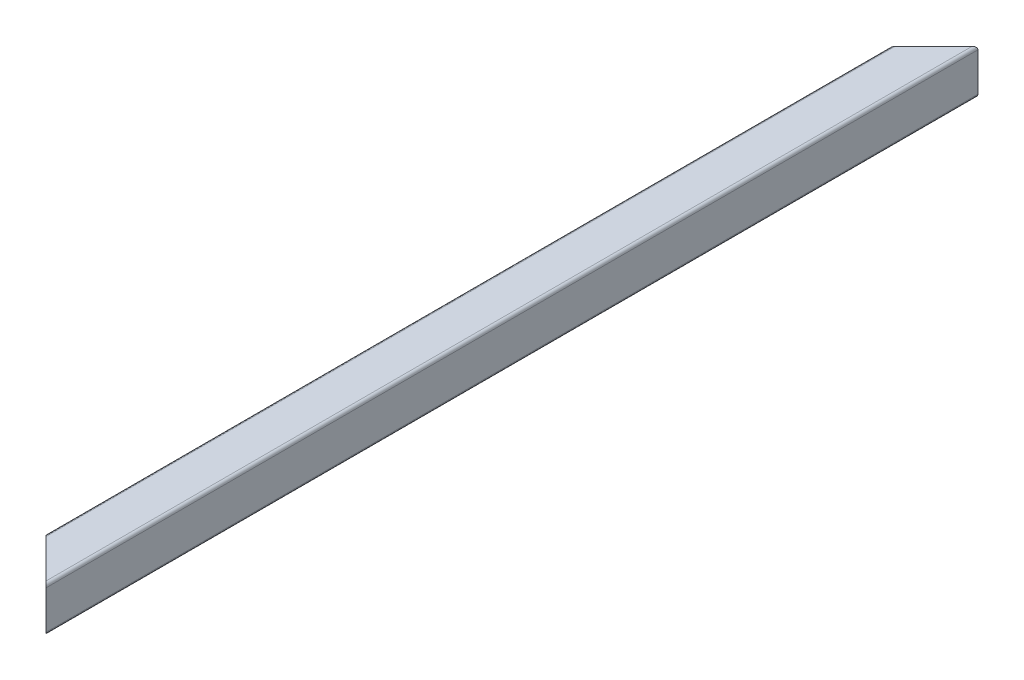
ISO-10303-21;
HEADER;
FILE_DESCRIPTION(('STEP AP214'),'2;1');
FILE_NAME('part.step','',(''),(''),'','','');
FILE_SCHEMA(('AUTOMOTIVE_DESIGN { 1 0 10303 214 1 1 1 1 }'));
ENDSEC;
DATA;
#1=APPLICATION_CONTEXT('core data for automotive mechanical design processes');
#2=APPLICATION_PROTOCOL_DEFINITION('international standard','automotive_design',2000,#1);
#3=PRODUCT_CONTEXT('',#1,'mechanical');
#4=PRODUCT('Part','Part','',(#3));
#5=PRODUCT_RELATED_PRODUCT_CATEGORY('part','',(#4));
#6=PRODUCT_DEFINITION_FORMATION('','',#4);
#7=PRODUCT_DEFINITION_CONTEXT('part definition',#1,'design');
#8=PRODUCT_DEFINITION('design','',#6,#7);
#9=PRODUCT_DEFINITION_SHAPE('','',#8);
#10=(LENGTH_UNIT() NAMED_UNIT(*) SI_UNIT(.MILLI.,.METRE.));
#11=(NAMED_UNIT(*) PLANE_ANGLE_UNIT() SI_UNIT($,.RADIAN.));
#12=(NAMED_UNIT(*) SI_UNIT($,.STERADIAN.) SOLID_ANGLE_UNIT());
#13=UNCERTAINTY_MEASURE_WITH_UNIT(LENGTH_MEASURE(1.E-05),#10,'distance_accuracy_value','');
#14=(GEOMETRIC_REPRESENTATION_CONTEXT(3) GLOBAL_UNCERTAINTY_ASSIGNED_CONTEXT((#13)) GLOBAL_UNIT_ASSIGNED_CONTEXT((#10,
#11,#12)) REPRESENTATION_CONTEXT('',''));
#15=CARTESIAN_POINT('',(0.,0.,0.));
#16=DIRECTION('',(0.,0.,1.));
#17=DIRECTION('',(1.,0.,0.));
#18=AXIS2_PLACEMENT_3D('',#15,#16,#17);
#19=CARTESIAN_POINT('',(15.,13.,-315.));
#20=DIRECTION('',(1.,0.,0.));
#21=DIRECTION('',(0.,1.,0.));
#22=AXIS2_PLACEMENT_3D('',#19,#20,#21);
#23=PLANE('',#22);
#24=DIRECTION('',(0.,0.,1.));
#25=VECTOR('',#24,1.);
#26=CARTESIAN_POINT('',(15.,13.,-315.));
#27=LINE('',#26,#25);
#28=CARTESIAN_POINT('',(15.,13.,-315.));
#29=VERTEX_POINT('',#28);
#30=CARTESIAN_POINT('',(15.,13.,315.));
#31=VERTEX_POINT('',#30);
#32=EDGE_CURVE('E157',#29,#31,#27,.T.);
#33=ORIENTED_EDGE('',*,*,#32,.T.);
#34=DIRECTION('',(0.,1.,0.));
#35=VECTOR('',#34,1.);
#36=CARTESIAN_POINT('',(15.,13.,315.));
#37=LINE('',#36,#35);
#38=CARTESIAN_POINT('',(15.,-13.,315.));
#39=VERTEX_POINT('',#38);
#40=EDGE_CURVE('E213',#39,#31,#37,.T.);
#41=ORIENTED_EDGE('',*,*,#40,.F.);
#42=DIRECTION('',(0.,0.,1.));
#43=VECTOR('',#42,1.);
#44=CARTESIAN_POINT('',(15.,-13.,-315.));
#45=LINE('',#44,#43);
#46=CARTESIAN_POINT('',(15.,-13.,-315.));
#47=VERTEX_POINT('',#46);
#48=EDGE_CURVE('E159',#47,#39,#45,.T.);
#49=ORIENTED_EDGE('',*,*,#48,.F.);
#50=DIRECTION('',(0.,1.,0.));
#51=VECTOR('',#50,1.);
#52=CARTESIAN_POINT('',(15.,13.,-315.));
#53=LINE('',#52,#51);
#54=EDGE_CURVE('E161',#47,#29,#53,.T.);
#55=ORIENTED_EDGE('',*,*,#54,.T.);
#56=EDGE_LOOP('',(#33,#41,#49,#55));
#57=FACE_BOUND('',#56,.T.);
#58=ADVANCED_FACE('F34',(#57),#23,.T.);
#59=CARTESIAN_POINT('',(13.,13.,-315.));
#60=DIRECTION('',(0.,0.,1.));
#61=DIRECTION('',(1.,0.,0.));
#62=AXIS2_PLACEMENT_3D('',#59,#60,#61);
#63=CYLINDRICAL_SURFACE('',#62,2.);
#64=ORIENTED_EDGE('',*,*,#32,.F.);
#65=CARTESIAN_POINT('',(13.,13.,-313.));
#66=DIRECTION('',(-0.707106781186544,0.,-0.707106781186551));
#67=DIRECTION('',(-0.707106781186551,0.,0.707106781186544));
#68=AXIS2_PLACEMENT_3D('',#65,#66,#67);
#69=ELLIPSE('',#68,2.82842712474618,2.);
#70=CARTESIAN_POINT('',(13.,15.,-313.));
#71=VERTEX_POINT('',#70);
#72=EDGE_CURVE('E202',#29,#71,#69,.F.);
#73=ORIENTED_EDGE('',*,*,#72,.T.);
#74=DIRECTION('',(0.,0.,1.));
#75=VECTOR('',#74,1.);
#76=CARTESIAN_POINT('',(13.,15.,-315.));
#77=LINE('',#76,#75);
#78=CARTESIAN_POINT('',(13.,15.,313.));
#79=VERTEX_POINT('',#78);
#80=EDGE_CURVE('E151',#71,#79,#77,.T.);
#81=ORIENTED_EDGE('',*,*,#80,.T.);
#82=CARTESIAN_POINT('',(13.,13.,313.));
#83=DIRECTION('',(-0.707106781186544,0.,0.707106781186551));
#84=DIRECTION('',(0.707106781186551,0.,0.707106781186544));
#85=AXIS2_PLACEMENT_3D('',#82,#83,#84);
#86=ELLIPSE('',#85,2.82842712474618,2.);
#87=EDGE_CURVE('E232',#79,#31,#86,.F.);
#88=ORIENTED_EDGE('',*,*,#87,.T.);
#89=EDGE_LOOP('',(#64,#73,#81,#88));
#90=FACE_BOUND('',#89,.T.);
#91=ADVANCED_FACE('F245',(#90),#63,.T.);
#92=CARTESIAN_POINT('',(-13.,15.,-315.));
#93=DIRECTION('',(0.,1.,0.));
#94=DIRECTION('',(0.,0.,1.));
#95=AXIS2_PLACEMENT_3D('',#92,#93,#94);
#96=PLANE('',#95);
#97=ORIENTED_EDGE('',*,*,#80,.F.);
#98=DIRECTION('',(-0.707106781186551,0.,0.707106781186544));
#99=VECTOR('',#98,1.);
#100=CARTESIAN_POINT('',(0.999999999999864,15.,-301.));
#101=LINE('',#100,#99);
#102=CARTESIAN_POINT('',(-13.,15.,-287.));
#103=VERTEX_POINT('',#102);
#104=EDGE_CURVE('E205',#71,#103,#101,.T.);
#105=ORIENTED_EDGE('',*,*,#104,.T.);
#106=DIRECTION('',(0.,0.,1.));
#107=VECTOR('',#106,1.);
#108=CARTESIAN_POINT('',(-13.,15.,-315.));
#109=LINE('',#108,#107);
#110=CARTESIAN_POINT('',(-13.,15.,287.));
#111=VERTEX_POINT('',#110);
#112=EDGE_CURVE('E147',#103,#111,#109,.T.);
#113=ORIENTED_EDGE('',*,*,#112,.T.);
#114=DIRECTION('',(0.707106781186551,0.,0.707106781186544));
#115=VECTOR('',#114,1.);
#116=CARTESIAN_POINT('',(-314.,15.,-13.9999999999967));
#117=LINE('',#116,#115);
#118=EDGE_CURVE('E127',#111,#79,#117,.T.);
#119=ORIENTED_EDGE('',*,*,#118,.T.);
#120=EDGE_LOOP('',(#97,#105,#113,#119));
#121=FACE_BOUND('',#120,.T.);
#122=ADVANCED_FACE('F242',(#121),#96,.T.);
#123=CARTESIAN_POINT('',(-13.,13.,-315.));
#124=DIRECTION('',(0.,0.,1.));
#125=DIRECTION('',(1.,0.,0.));
#126=AXIS2_PLACEMENT_3D('',#123,#124,#125);
#127=CYLINDRICAL_SURFACE('',#126,2.);
#128=ORIENTED_EDGE('',*,*,#112,.F.);
#129=CARTESIAN_POINT('',(-13.,13.,-287.));
#130=DIRECTION('',(-0.707106781186544,0.,-0.707106781186551));
#131=DIRECTION('',(-0.707106781186551,0.,0.707106781186544));
#132=AXIS2_PLACEMENT_3D('',#129,#130,#131);
#133=ELLIPSE('',#132,2.82842712474618,2.);
#134=CARTESIAN_POINT('',(-15.,13.,-285.));
#135=VERTEX_POINT('',#134);
#136=EDGE_CURVE('E146',#103,#135,#133,.F.);
#137=ORIENTED_EDGE('',*,*,#136,.T.);
#138=DIRECTION('',(0.,0.,1.));
#139=VECTOR('',#138,1.);
#140=CARTESIAN_POINT('',(-15.,13.,-315.));
#141=LINE('',#140,#139);
#142=CARTESIAN_POINT('',(-15.,13.,285.));
#143=VERTEX_POINT('',#142);
#144=EDGE_CURVE('E139',#135,#143,#141,.T.);
#145=ORIENTED_EDGE('',*,*,#144,.T.);
#146=CARTESIAN_POINT('',(-13.,13.,287.));
#147=DIRECTION('',(-0.707106781186544,0.,0.707106781186551));
#148=DIRECTION('',(0.707106781186551,0.,0.707106781186544));
#149=AXIS2_PLACEMENT_3D('',#146,#147,#148);
#150=ELLIPSE('',#149,2.82842712474618,2.);
#151=EDGE_CURVE('E121',#143,#111,#150,.F.);
#152=ORIENTED_EDGE('',*,*,#151,.T.);
#153=EDGE_LOOP('',(#128,#137,#145,#152));
#154=FACE_BOUND('',#153,.T.);
#155=ADVANCED_FACE('F145',(#154),#127,.T.);
#156=CARTESIAN_POINT('',(-15.,13.,-315.));
#157=DIRECTION('',(-1.,0.,0.));
#158=DIRECTION('',(0.,-1.,0.));
#159=AXIS2_PLACEMENT_3D('',#156,#157,#158);
#160=PLANE('',#159);
#161=ORIENTED_EDGE('',*,*,#144,.F.);
#162=DIRECTION('',(0.,-1.,0.));
#163=VECTOR('',#162,1.);
#164=CARTESIAN_POINT('',(-15.,250.,-285.));
#165=LINE('',#164,#163);
#166=CARTESIAN_POINT('',(-15.,-13.,-285.));
#167=VERTEX_POINT('',#166);
#168=EDGE_CURVE('E142',#135,#167,#165,.T.);
#169=ORIENTED_EDGE('',*,*,#168,.T.);
#170=DIRECTION('',(0.,0.,1.));
#171=VECTOR('',#170,1.);
#172=CARTESIAN_POINT('',(-15.,-13.,-315.));
#173=LINE('',#172,#171);
#174=CARTESIAN_POINT('',(-15.,-13.,285.));
#175=VERTEX_POINT('',#174);
#176=EDGE_CURVE('E141',#167,#175,#173,.T.);
#177=ORIENTED_EDGE('',*,*,#176,.T.);
#178=DIRECTION('',(0.,-1.,0.));
#179=VECTOR('',#178,1.);
#180=CARTESIAN_POINT('',(-15.,250.,285.));
#181=LINE('',#180,#179);
#182=EDGE_CURVE('E124',#143,#175,#181,.T.);
#183=ORIENTED_EDGE('',*,*,#182,.F.);
#184=EDGE_LOOP('',(#161,#169,#177,#183));
#185=FACE_BOUND('',#184,.T.);
#186=ADVANCED_FACE('F137',(#185),#160,.T.);
#187=CARTESIAN_POINT('',(-13.,-13.,-315.));
#188=DIRECTION('',(0.,0.,1.));
#189=DIRECTION('',(1.,0.,0.));
#190=AXIS2_PLACEMENT_3D('',#187,#188,#189);
#191=CYLINDRICAL_SURFACE('',#190,2.);
#192=ORIENTED_EDGE('',*,*,#176,.F.);
#193=CARTESIAN_POINT('',(-13.,-13.,-287.));
#194=DIRECTION('',(-0.707106781186544,0.,-0.707106781186551));
#195=DIRECTION('',(-0.707106781186551,0.,0.707106781186544));
#196=AXIS2_PLACEMENT_3D('',#193,#194,#195);
#197=ELLIPSE('',#196,2.82842712474618,2.);
#198=CARTESIAN_POINT('',(-13.,-15.,-287.));
#199=VERTEX_POINT('',#198);
#200=EDGE_CURVE('E184',#167,#199,#197,.F.);
#201=ORIENTED_EDGE('',*,*,#200,.T.);
#202=DIRECTION('',(0.,0.,1.));
#203=VECTOR('',#202,1.);
#204=CARTESIAN_POINT('',(-13.,-15.,-315.));
#205=LINE('',#204,#203);
#206=CARTESIAN_POINT('',(-13.,-15.,287.));
#207=VERTEX_POINT('',#206);
#208=EDGE_CURVE('E149',#199,#207,#205,.T.);
#209=ORIENTED_EDGE('',*,*,#208,.T.);
#210=CARTESIAN_POINT('',(-13.,-13.,287.));
#211=DIRECTION('',(-0.707106781186544,0.,0.707106781186551));
#212=DIRECTION('',(0.707106781186551,0.,0.707106781186544));
#213=AXIS2_PLACEMENT_3D('',#210,#211,#212);
#214=ELLIPSE('',#213,2.82842712474618,2.);
#215=EDGE_CURVE('E132',#207,#175,#214,.F.);
#216=ORIENTED_EDGE('',*,*,#215,.T.);
#217=EDGE_LOOP('',(#192,#201,#209,#216));
#218=FACE_BOUND('',#217,.T.);
#219=ADVANCED_FACE('F183',(#218),#191,.T.);
#220=CARTESIAN_POINT('',(-13.,-15.,-315.));
#221=DIRECTION('',(0.,-1.,0.));
#222=DIRECTION('',(0.,0.,-1.));
#223=AXIS2_PLACEMENT_3D('',#220,#221,#222);
#224=PLANE('',#223);
#225=ORIENTED_EDGE('',*,*,#208,.F.);
#226=DIRECTION('',(0.707106781186551,0.,-0.707106781186544));
#227=VECTOR('',#226,1.);
#228=CARTESIAN_POINT('',(0.999999999999866,-15.,-301.));
#229=LINE('',#228,#227);
#230=CARTESIAN_POINT('',(13.,-15.,-313.));
#231=VERTEX_POINT('',#230);
#232=EDGE_CURVE('E189',#199,#231,#229,.T.);
#233=ORIENTED_EDGE('',*,*,#232,.T.);
#234=DIRECTION('',(0.,0.,1.));
#235=VECTOR('',#234,1.);
#236=CARTESIAN_POINT('',(13.,-15.,-315.));
#237=LINE('',#236,#235);
#238=CARTESIAN_POINT('',(13.,-15.,313.));
#239=VERTEX_POINT('',#238);
#240=EDGE_CURVE('E42',#231,#239,#237,.T.);
#241=ORIENTED_EDGE('',*,*,#240,.T.);
#242=DIRECTION('',(-0.707106781186551,0.,-0.707106781186544));
#243=VECTOR('',#242,1.);
#244=CARTESIAN_POINT('',(-314.,-15.,-13.9999999999967));
#245=LINE('',#244,#243);
#246=EDGE_CURVE('E191',#239,#207,#245,.T.);
#247=ORIENTED_EDGE('',*,*,#246,.T.);
#248=EDGE_LOOP('',(#225,#233,#241,#247));
#249=FACE_BOUND('',#248,.T.);
#250=ADVANCED_FACE('F188',(#249),#224,.T.);
#251=CARTESIAN_POINT('',(13.,-13.,-315.));
#252=DIRECTION('',(0.,0.,1.));
#253=DIRECTION('',(1.,0.,0.));
#254=AXIS2_PLACEMENT_3D('',#251,#252,#253);
#255=CYLINDRICAL_SURFACE('',#254,2.);
#256=ORIENTED_EDGE('',*,*,#240,.F.);
#257=CARTESIAN_POINT('',(13.,-13.,-313.));
#258=DIRECTION('',(-0.707106781186544,0.,-0.707106781186551));
#259=DIRECTION('',(-0.707106781186551,0.,0.707106781186544));
#260=AXIS2_PLACEMENT_3D('',#257,#258,#259);
#261=ELLIPSE('',#260,2.82842712474618,2.);
#262=EDGE_CURVE('E211',#231,#47,#261,.F.);
#263=ORIENTED_EDGE('',*,*,#262,.T.);
#264=ORIENTED_EDGE('',*,*,#48,.T.);
#265=CARTESIAN_POINT('',(13.,-13.,313.));
#266=DIRECTION('',(-0.707106781186544,0.,0.707106781186551));
#267=DIRECTION('',(0.707106781186551,0.,0.707106781186544));
#268=AXIS2_PLACEMENT_3D('',#265,#266,#267);
#269=ELLIPSE('',#268,2.82842712474618,2.);
#270=EDGE_CURVE('E192',#39,#239,#269,.F.);
#271=ORIENTED_EDGE('',*,*,#270,.T.);
#272=EDGE_LOOP('',(#256,#263,#264,#271));
#273=FACE_BOUND('',#272,.T.);
#274=ADVANCED_FACE('F36',(#273),#255,.T.);
#275=CARTESIAN_POINT('',(15.,250.,315.));
#276=DIRECTION('',(-0.707106781186544,0.,0.707106781186551));
#277=DIRECTION('',(0.707106781186551,0.,0.707106781186544));
#278=AXIS2_PLACEMENT_3D('',#275,#276,#277);
#279=PLANE('',#278);
#280=ORIENTED_EDGE('',*,*,#40,.T.);
#281=ORIENTED_EDGE('',*,*,#87,.F.);
#282=ORIENTED_EDGE('',*,*,#118,.F.);
#283=ORIENTED_EDGE('',*,*,#151,.F.);
#284=ORIENTED_EDGE('',*,*,#182,.T.);
#285=ORIENTED_EDGE('',*,*,#215,.F.);
#286=ORIENTED_EDGE('',*,*,#246,.F.);
#287=ORIENTED_EDGE('',*,*,#270,.F.);
#288=EDGE_LOOP('',(#280,#281,#282,#283,#284,#285,#286,#287));
#289=FACE_BOUND('',#288,.T.);
#290=DIRECTION('',(0.,1.,0.));
#291=VECTOR('',#290,1.);
#292=CARTESIAN_POINT('',(-13.,13.0000000000001,287.));
#293=LINE('',#292,#291);
#294=CARTESIAN_POINT('',(-13.,-13.,287.));
#295=VERTEX_POINT('',#294);
#296=CARTESIAN_POINT('',(-13.,13.,287.));
#297=VERTEX_POINT('',#296);
#298=EDGE_CURVE('E230',#295,#297,#293,.T.);
#299=ORIENTED_EDGE('',*,*,#298,.T.);
#300=DIRECTION('',(0.707106781186551,0.,0.707106781186544));
#301=VECTOR('',#300,1.);
#302=CARTESIAN_POINT('',(-314.,13.,-13.9999999999967));
#303=LINE('',#302,#301);
#304=CARTESIAN_POINT('',(13.,13.,313.));
#305=VERTEX_POINT('',#304);
#306=EDGE_CURVE('E233',#297,#305,#303,.T.);
#307=ORIENTED_EDGE('',*,*,#306,.T.);
#308=DIRECTION('',(0.,-1.,0.));
#309=VECTOR('',#308,1.);
#310=CARTESIAN_POINT('',(13.,13.,313.));
#311=LINE('',#310,#309);
#312=CARTESIAN_POINT('',(13.,-13.,313.));
#313=VERTEX_POINT('',#312);
#314=EDGE_CURVE('E49',#305,#313,#311,.T.);
#315=ORIENTED_EDGE('',*,*,#314,.T.);
#316=DIRECTION('',(-0.707106781186551,0.,-0.707106781186544));
#317=VECTOR('',#316,1.);
#318=CARTESIAN_POINT('',(-314.,-13.,-13.9999999999967));
#319=LINE('',#318,#317);
#320=EDGE_CURVE('E225',#313,#295,#319,.T.);
#321=ORIENTED_EDGE('',*,*,#320,.T.);
#322=EDGE_LOOP('',(#299,#307,#315,#321));
#323=FACE_BOUND('',#322,.T.);
#324=ADVANCED_FACE('F123',(#289,#323),#279,.T.);
#325=CARTESIAN_POINT('',(-13.,13.,-315.));
#326=DIRECTION('',(-1.,0.,0.));
#327=DIRECTION('',(0.,-1.,0.));
#328=AXIS2_PLACEMENT_3D('',#325,#326,#327);
#329=PLANE('',#328);
#330=DIRECTION('',(0.,-1.,0.));
#331=VECTOR('',#330,1.);
#332=CARTESIAN_POINT('',(-13.,13.,-287.));
#333=LINE('',#332,#331);
#334=CARTESIAN_POINT('',(-13.,13.,-287.));
#335=VERTEX_POINT('',#334);
#336=CARTESIAN_POINT('',(-13.,-13.,-287.));
#337=VERTEX_POINT('',#336);
#338=EDGE_CURVE('E56',#335,#337,#333,.T.);
#339=ORIENTED_EDGE('',*,*,#338,.F.);
#340=DIRECTION('',(0.,0.,1.));
#341=VECTOR('',#340,1.);
#342=CARTESIAN_POINT('',(-13.,13.,-315.));
#343=LINE('',#342,#341);
#344=EDGE_CURVE('E168',#335,#297,#343,.T.);
#345=ORIENTED_EDGE('',*,*,#344,.T.);
#346=ORIENTED_EDGE('',*,*,#298,.F.);
#347=DIRECTION('',(0.,0.,1.));
#348=VECTOR('',#347,1.);
#349=CARTESIAN_POINT('',(-13.,-13.,-315.));
#350=LINE('',#349,#348);
#351=EDGE_CURVE('E176',#337,#295,#350,.T.);
#352=ORIENTED_EDGE('',*,*,#351,.F.);
#353=EDGE_LOOP('',(#339,#345,#346,#352));
#354=FACE_BOUND('',#353,.T.);
#355=ADVANCED_FACE('F228',(#354),#329,.F.);
#356=CARTESIAN_POINT('',(-13.,13.,-315.));
#357=DIRECTION('',(0.,1.,0.));
#358=DIRECTION('',(0.,0.,1.));
#359=AXIS2_PLACEMENT_3D('',#356,#357,#358);
#360=PLANE('',#359);
#361=DIRECTION('',(-0.707106781186551,0.,0.707106781186544));
#362=VECTOR('',#361,1.);
#363=CARTESIAN_POINT('',(0.999999999999859,13.,-301.));
#364=LINE('',#363,#362);
#365=CARTESIAN_POINT('',(13.,13.,-313.));
#366=VERTEX_POINT('',#365);
#367=EDGE_CURVE('E199',#366,#335,#364,.T.);
#368=ORIENTED_EDGE('',*,*,#367,.F.);
#369=DIRECTION('',(0.,0.,1.));
#370=VECTOR('',#369,1.);
#371=CARTESIAN_POINT('',(13.,13.,-315.));
#372=LINE('',#371,#370);
#373=EDGE_CURVE('E172',#366,#305,#372,.T.);
#374=ORIENTED_EDGE('',*,*,#373,.T.);
#375=ORIENTED_EDGE('',*,*,#306,.F.);
#376=ORIENTED_EDGE('',*,*,#344,.F.);
#377=EDGE_LOOP('',(#368,#374,#375,#376));
#378=FACE_BOUND('',#377,.T.);
#379=ADVANCED_FACE('F256',(#378),#360,.F.);
#380=CARTESIAN_POINT('',(13.,13.,-315.));
#381=DIRECTION('',(1.,0.,0.));
#382=DIRECTION('',(0.,1.,0.));
#383=AXIS2_PLACEMENT_3D('',#380,#381,#382);
#384=PLANE('',#383);
#385=DIRECTION('',(0.,1.,0.));
#386=VECTOR('',#385,1.);
#387=CARTESIAN_POINT('',(13.,13.,-313.));
#388=LINE('',#387,#386);
#389=CARTESIAN_POINT('',(13.,-13.,-313.));
#390=VERTEX_POINT('',#389);
#391=EDGE_CURVE('E194',#390,#366,#388,.T.);
#392=ORIENTED_EDGE('',*,*,#391,.F.);
#393=DIRECTION('',(0.,0.,1.));
#394=VECTOR('',#393,1.);
#395=CARTESIAN_POINT('',(13.,-13.,-315.));
#396=LINE('',#395,#394);
#397=EDGE_CURVE('E216',#390,#313,#396,.T.);
#398=ORIENTED_EDGE('',*,*,#397,.T.);
#399=ORIENTED_EDGE('',*,*,#314,.F.);
#400=ORIENTED_EDGE('',*,*,#373,.F.);
#401=EDGE_LOOP('',(#392,#398,#399,#400));
#402=FACE_BOUND('',#401,.T.);
#403=ADVANCED_FACE('F278',(#402),#384,.F.);
#404=CARTESIAN_POINT('',(-13.,-13.,-315.));
#405=DIRECTION('',(0.,-1.,0.));
#406=DIRECTION('',(1.,0.,0.));
#407=AXIS2_PLACEMENT_3D('',#404,#405,#406);
#408=PLANE('',#407);
#409=DIRECTION('',(0.707106781186551,0.,-0.707106781186544));
#410=VECTOR('',#409,1.);
#411=CARTESIAN_POINT('',(0.999999999999857,-13.,-301.));
#412=LINE('',#411,#410);
#413=EDGE_CURVE('E11',#337,#390,#412,.T.);
#414=ORIENTED_EDGE('',*,*,#413,.F.);
#415=ORIENTED_EDGE('',*,*,#351,.T.);
#416=ORIENTED_EDGE('',*,*,#320,.F.);
#417=ORIENTED_EDGE('',*,*,#397,.F.);
#418=EDGE_LOOP('',(#414,#415,#416,#417));
#419=FACE_BOUND('',#418,.T.);
#420=ADVANCED_FACE('F224',(#419),#408,.F.);
#421=CARTESIAN_POINT('',(15.,250.,-315.));
#422=DIRECTION('',(-0.707106781186544,0.,-0.707106781186551));
#423=DIRECTION('',(-0.707106781186551,0.,0.707106781186544));
#424=AXIS2_PLACEMENT_3D('',#421,#422,#423);
#425=PLANE('',#424);
#426=ORIENTED_EDGE('',*,*,#232,.F.);
#427=ORIENTED_EDGE('',*,*,#200,.F.);
#428=ORIENTED_EDGE('',*,*,#168,.F.);
#429=ORIENTED_EDGE('',*,*,#136,.F.);
#430=ORIENTED_EDGE('',*,*,#104,.F.);
#431=ORIENTED_EDGE('',*,*,#72,.F.);
#432=ORIENTED_EDGE('',*,*,#54,.F.);
#433=ORIENTED_EDGE('',*,*,#262,.F.);
#434=EDGE_LOOP('',(#426,#427,#428,#429,#430,#431,#432,#433));
#435=FACE_BOUND('',#434,.T.);
#436=ORIENTED_EDGE('',*,*,#338,.T.);
#437=ORIENTED_EDGE('',*,*,#413,.T.);
#438=ORIENTED_EDGE('',*,*,#391,.T.);
#439=ORIENTED_EDGE('',*,*,#367,.T.);
#440=EDGE_LOOP('',(#436,#437,#438,#439));
#441=FACE_BOUND('',#440,.T.);
#442=ADVANCED_FACE('F247',(#435,#441),#425,.T.);
#443=CLOSED_SHELL('',(#58,#91,#122,#155,#186,#219,#250,#274,#324,#355,#379,#403,#420,#442));
#444=MANIFOLD_SOLID_BREP('B2',#443);
#445=ADVANCED_BREP_SHAPE_REPRESENTATION('',(#18,#444),#14);
#446=SHAPE_DEFINITION_REPRESENTATION(#9,#445);
ENDSEC;
END-ISO-10303-21;
